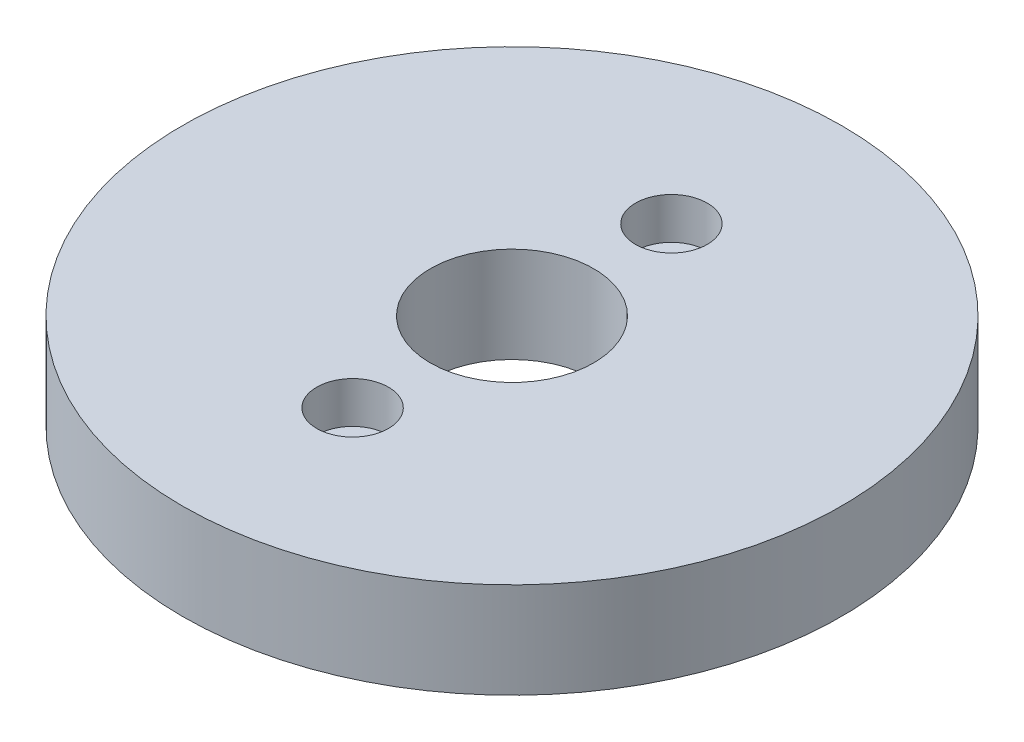
ISO-10303-21;
HEADER;
FILE_DESCRIPTION(('STEP AP214'),'2;1');
FILE_NAME('part.step','',(''),(''),'','','');
FILE_SCHEMA(('AUTOMOTIVE_DESIGN { 1 0 10303 214 1 1 1 1 }'));
ENDSEC;
DATA;
#1=APPLICATION_CONTEXT('core data for automotive mechanical design processes');
#2=APPLICATION_PROTOCOL_DEFINITION('international standard','automotive_design',2000,#1);
#3=PRODUCT_CONTEXT('',#1,'mechanical');
#4=PRODUCT('Part','Part','',(#3));
#5=PRODUCT_RELATED_PRODUCT_CATEGORY('part','',(#4));
#6=PRODUCT_DEFINITION_FORMATION('','',#4);
#7=PRODUCT_DEFINITION_CONTEXT('part definition',#1,'design');
#8=PRODUCT_DEFINITION('design','',#6,#7);
#9=PRODUCT_DEFINITION_SHAPE('','',#8);
#10=(LENGTH_UNIT() NAMED_UNIT(*) SI_UNIT(.MILLI.,.METRE.));
#11=(NAMED_UNIT(*) PLANE_ANGLE_UNIT() SI_UNIT($,.RADIAN.));
#12=(NAMED_UNIT(*) SI_UNIT($,.STERADIAN.) SOLID_ANGLE_UNIT());
#13=UNCERTAINTY_MEASURE_WITH_UNIT(LENGTH_MEASURE(1.E-05),#10,'distance_accuracy_value','');
#14=(GEOMETRIC_REPRESENTATION_CONTEXT(3) GLOBAL_UNCERTAINTY_ASSIGNED_CONTEXT((#13)) GLOBAL_UNIT_ASSIGNED_CONTEXT((#10,
#11,#12)) REPRESENTATION_CONTEXT('',''));
#15=CARTESIAN_POINT('',(0.,0.,0.));
#16=DIRECTION('',(0.,0.,1.));
#17=DIRECTION('',(1.,0.,0.));
#18=AXIS2_PLACEMENT_3D('',#15,#16,#17);
#19=CARTESIAN_POINT('',(0.,-13.,20.));
#20=DIRECTION('',(0.,1.,0.));
#21=DIRECTION('',(0.,0.,1.));
#22=AXIS2_PLACEMENT_3D('',#19,#20,#21);
#23=CYLINDRICAL_SURFACE('',#22,2.75);
#24=CARTESIAN_POINT('',(0.,0.,20.));
#25=DIRECTION('',(0.,1.,0.));
#26=DIRECTION('',(0.,0.,1.));
#27=AXIS2_PLACEMENT_3D('',#24,#25,#26);
#28=CIRCLE('',#27,2.75);
#29=CARTESIAN_POINT('',(0.,0.,22.75));
#30=VERTEX_POINT('',#29);
#31=EDGE_CURVE('E64',#30,#30,#28,.T.);
#32=ORIENTED_EDGE('',*,*,#31,.F.);
#33=EDGE_LOOP('',(#32));
#34=FACE_BOUND('',#33,.T.);
#35=CARTESIAN_POINT('',(0.,6.8,20.));
#36=DIRECTION('',(0.,1.,0.));
#37=DIRECTION('',(0.,0.,1.));
#38=AXIS2_PLACEMENT_3D('',#35,#36,#37);
#39=CIRCLE('',#38,2.75);
#40=CARTESIAN_POINT('',(0.,6.8,22.75));
#41=VERTEX_POINT('',#40);
#42=EDGE_CURVE('E47',#41,#41,#39,.F.);
#43=ORIENTED_EDGE('',*,*,#42,.F.);
#44=EDGE_LOOP('',(#43));
#45=FACE_BOUND('',#44,.T.);
#46=ADVANCED_FACE('F43',(#34,#45),#23,.F.);
#47=CARTESIAN_POINT('',(0.,-13.,-20.));
#48=DIRECTION('',(0.,1.,0.));
#49=DIRECTION('',(0.,0.,1.));
#50=AXIS2_PLACEMENT_3D('',#47,#48,#49);
#51=CYLINDRICAL_SURFACE('',#50,2.75);
#52=CARTESIAN_POINT('',(0.,0.,-20.));
#53=DIRECTION('',(0.,1.,0.));
#54=DIRECTION('',(0.,0.,1.));
#55=AXIS2_PLACEMENT_3D('',#52,#53,#54);
#56=CIRCLE('',#55,2.75);
#57=CARTESIAN_POINT('',(0.,0.,-17.25));
#58=VERTEX_POINT('',#57);
#59=EDGE_CURVE('E58',#58,#58,#56,.T.);
#60=ORIENTED_EDGE('',*,*,#59,.F.);
#61=EDGE_LOOP('',(#60));
#62=FACE_BOUND('',#61,.T.);
#63=CARTESIAN_POINT('',(0.,6.8,-20.));
#64=DIRECTION('',(0.,1.,0.));
#65=DIRECTION('',(0.,0.,1.));
#66=AXIS2_PLACEMENT_3D('',#63,#64,#65);
#67=CIRCLE('',#66,2.75);
#68=CARTESIAN_POINT('',(0.,6.8,-17.25));
#69=VERTEX_POINT('',#68);
#70=EDGE_CURVE('E74',#69,#69,#67,.F.);
#71=ORIENTED_EDGE('',*,*,#70,.F.);
#72=EDGE_LOOP('',(#71));
#73=FACE_BOUND('',#72,.T.);
#74=ADVANCED_FACE('F135',(#62,#73),#51,.F.);
#75=CARTESIAN_POINT('',(0.,12.,0.));
#76=DIRECTION('',(0.,-1.,0.));
#77=DIRECTION('',(0.,0.,-1.));
#78=AXIS2_PLACEMENT_3D('',#75,#76,#77);
#79=CYLINDRICAL_SURFACE('',#78,41.35);
#80=CARTESIAN_POINT('',(0.,12.,0.));
#81=DIRECTION('',(0.,1.,0.));
#82=DIRECTION('',(0.,0.,1.));
#83=AXIS2_PLACEMENT_3D('',#80,#81,#82);
#84=CIRCLE('',#83,41.35);
#85=CARTESIAN_POINT('',(0.,12.,41.35));
#86=VERTEX_POINT('',#85);
#87=EDGE_CURVE('E10',#86,#86,#84,.T.);
#88=ORIENTED_EDGE('',*,*,#87,.F.);
#89=EDGE_LOOP('',(#88));
#90=FACE_BOUND('',#89,.T.);
#91=CARTESIAN_POINT('',(0.,0.,0.));
#92=DIRECTION('',(0.,1.,0.));
#93=DIRECTION('',(0.,0.,1.));
#94=AXIS2_PLACEMENT_3D('',#91,#92,#93);
#95=CIRCLE('',#94,41.35);
#96=CARTESIAN_POINT('',(0.,0.,41.35));
#97=VERTEX_POINT('',#96);
#98=EDGE_CURVE('E52',#97,#97,#95,.T.);
#99=ORIENTED_EDGE('',*,*,#98,.T.);
#100=EDGE_LOOP('',(#99));
#101=FACE_BOUND('',#100,.T.);
#102=ADVANCED_FACE('F45',(#90,#101),#79,.T.);
#103=CARTESIAN_POINT('',(0.,12.,0.));
#104=DIRECTION('',(0.,1.,0.));
#105=DIRECTION('',(0.,0.,1.));
#106=AXIS2_PLACEMENT_3D('',#103,#104,#105);
#107=PLANE('',#106);
#108=CARTESIAN_POINT('',(0.,12.,-20.));
#109=DIRECTION('',(0.,1.,0.));
#110=DIRECTION('',(0.,0.,1.));
#111=AXIS2_PLACEMENT_3D('',#108,#109,#110);
#112=CIRCLE('',#111,4.5);
#113=CARTESIAN_POINT('',(0.,12.,-15.5));
#114=VERTEX_POINT('',#113);
#115=EDGE_CURVE('E84',#114,#114,#112,.T.);
#116=ORIENTED_EDGE('',*,*,#115,.F.);
#117=EDGE_LOOP('',(#116));
#118=FACE_BOUND('',#117,.T.);
#119=CARTESIAN_POINT('',(0.,12.,20.));
#120=DIRECTION('',(0.,1.,0.));
#121=DIRECTION('',(0.,0.,1.));
#122=AXIS2_PLACEMENT_3D('',#119,#120,#121);
#123=CIRCLE('',#122,4.5);
#124=CARTESIAN_POINT('',(0.,12.,24.5));
#125=VERTEX_POINT('',#124);
#126=EDGE_CURVE('E90',#125,#125,#123,.T.);
#127=ORIENTED_EDGE('',*,*,#126,.F.);
#128=EDGE_LOOP('',(#127));
#129=FACE_BOUND('',#128,.T.);
#130=CARTESIAN_POINT('',(0.,12.,0.));
#131=DIRECTION('',(0.,1.,0.));
#132=DIRECTION('',(0.,0.,1.));
#133=AXIS2_PLACEMENT_3D('',#130,#131,#132);
#134=CIRCLE('',#133,10.25);
#135=CARTESIAN_POINT('',(0.,12.,10.25));
#136=VERTEX_POINT('',#135);
#137=EDGE_CURVE('E61',#136,#136,#134,.T.);
#138=ORIENTED_EDGE('',*,*,#137,.F.);
#139=EDGE_LOOP('',(#138));
#140=FACE_BOUND('',#139,.T.);
#141=ORIENTED_EDGE('',*,*,#87,.T.);
#142=EDGE_LOOP('',(#141));
#143=FACE_BOUND('',#142,.T.);
#144=ADVANCED_FACE('F109',(#118,#129,#140,#143),#107,.T.);
#145=CARTESIAN_POINT('',(0.,0.,0.));
#146=DIRECTION('',(0.,1.,0.));
#147=DIRECTION('',(0.,0.,1.));
#148=AXIS2_PLACEMENT_3D('',#145,#146,#147);
#149=PLANE('',#148);
#150=CARTESIAN_POINT('',(0.,0.,0.));
#151=DIRECTION('',(0.,1.,0.));
#152=DIRECTION('',(0.,0.,1.));
#153=AXIS2_PLACEMENT_3D('',#150,#151,#152);
#154=CIRCLE('',#153,10.25);
#155=CARTESIAN_POINT('',(0.,0.,10.25));
#156=VERTEX_POINT('',#155);
#157=EDGE_CURVE('E68',#156,#156,#154,.T.);
#158=ORIENTED_EDGE('',*,*,#157,.T.);
#159=EDGE_LOOP('',(#158));
#160=FACE_BOUND('',#159,.T.);
#161=ORIENTED_EDGE('',*,*,#59,.T.);
#162=EDGE_LOOP('',(#161));
#163=FACE_BOUND('',#162,.T.);
#164=ORIENTED_EDGE('',*,*,#31,.T.);
#165=EDGE_LOOP('',(#164));
#166=FACE_BOUND('',#165,.T.);
#167=ORIENTED_EDGE('',*,*,#98,.F.);
#168=EDGE_LOOP('',(#167));
#169=FACE_BOUND('',#168,.T.);
#170=ADVANCED_FACE('F112',(#160,#163,#166,#169),#149,.F.);
#171=CARTESIAN_POINT('',(0.,-13.,0.));
#172=DIRECTION('',(0.,1.,0.));
#173=DIRECTION('',(0.,0.,1.));
#174=AXIS2_PLACEMENT_3D('',#171,#172,#173);
#175=CYLINDRICAL_SURFACE('',#174,10.25);
#176=ORIENTED_EDGE('',*,*,#137,.T.);
#177=EDGE_LOOP('',(#176));
#178=FACE_BOUND('',#177,.T.);
#179=ORIENTED_EDGE('',*,*,#157,.F.);
#180=EDGE_LOOP('',(#179));
#181=FACE_BOUND('',#180,.T.);
#182=ADVANCED_FACE('F119',(#178,#181),#175,.F.);
#183=CARTESIAN_POINT('',(0.,6.8,-20.));
#184=DIRECTION('',(0.,1.,0.));
#185=DIRECTION('',(0.,0.,1.));
#186=AXIS2_PLACEMENT_3D('',#183,#184,#185);
#187=PLANE('',#186);
#188=CARTESIAN_POINT('',(0.,6.8,-20.));
#189=DIRECTION('',(0.,1.,0.));
#190=DIRECTION('',(0.,0.,1.));
#191=AXIS2_PLACEMENT_3D('',#188,#189,#190);
#192=CIRCLE('',#191,4.5);
#193=CARTESIAN_POINT('',(0.,6.8,-15.5));
#194=VERTEX_POINT('',#193);
#195=EDGE_CURVE('E77',#194,#194,#192,.T.);
#196=ORIENTED_EDGE('',*,*,#195,.T.);
#197=EDGE_LOOP('',(#196));
#198=FACE_BOUND('',#197,.T.);
#199=ORIENTED_EDGE('',*,*,#70,.T.);
#200=EDGE_LOOP('',(#199));
#201=FACE_BOUND('',#200,.T.);
#202=ADVANCED_FACE('F122',(#198,#201),#187,.T.);
#203=CARTESIAN_POINT('',(0.,6.8,-20.));
#204=DIRECTION('',(0.,1.,0.));
#205=DIRECTION('',(0.,0.,1.));
#206=AXIS2_PLACEMENT_3D('',#203,#204,#205);
#207=CYLINDRICAL_SURFACE('',#206,4.5);
#208=ORIENTED_EDGE('',*,*,#195,.F.);
#209=EDGE_LOOP('',(#208));
#210=FACE_BOUND('',#209,.T.);
#211=ORIENTED_EDGE('',*,*,#115,.T.);
#212=EDGE_LOOP('',(#211));
#213=FACE_BOUND('',#212,.T.);
#214=ADVANCED_FACE('F150',(#210,#213),#207,.F.);
#215=CARTESIAN_POINT('',(0.,6.8,20.));
#216=DIRECTION('',(0.,1.,0.));
#217=DIRECTION('',(0.,0.,1.));
#218=AXIS2_PLACEMENT_3D('',#215,#216,#217);
#219=PLANE('',#218);
#220=CARTESIAN_POINT('',(0.,6.8,20.));
#221=DIRECTION('',(0.,1.,0.));
#222=DIRECTION('',(0.,0.,1.));
#223=AXIS2_PLACEMENT_3D('',#220,#221,#222);
#224=CIRCLE('',#223,4.5);
#225=CARTESIAN_POINT('',(0.,6.8,24.5));
#226=VERTEX_POINT('',#225);
#227=EDGE_CURVE('E95',#226,#226,#224,.T.);
#228=ORIENTED_EDGE('',*,*,#227,.T.);
#229=EDGE_LOOP('',(#228));
#230=FACE_BOUND('',#229,.T.);
#231=ORIENTED_EDGE('',*,*,#42,.T.);
#232=EDGE_LOOP('',(#231));
#233=FACE_BOUND('',#232,.T.);
#234=ADVANCED_FACE('F100',(#230,#233),#219,.T.);
#235=CARTESIAN_POINT('',(0.,6.8,20.));
#236=DIRECTION('',(0.,1.,0.));
#237=DIRECTION('',(0.,0.,1.));
#238=AXIS2_PLACEMENT_3D('',#235,#236,#237);
#239=CYLINDRICAL_SURFACE('',#238,4.5);
#240=ORIENTED_EDGE('',*,*,#227,.F.);
#241=EDGE_LOOP('',(#240));
#242=FACE_BOUND('',#241,.T.);
#243=ORIENTED_EDGE('',*,*,#126,.T.);
#244=EDGE_LOOP('',(#243));
#245=FACE_BOUND('',#244,.T.);
#246=ADVANCED_FACE('F103',(#242,#245),#239,.F.);
#247=CLOSED_SHELL('',(#46,#74,#102,#144,#170,#182,#202,#214,#234,#246));
#248=MANIFOLD_SOLID_BREP('B2',#247);
#249=ADVANCED_BREP_SHAPE_REPRESENTATION('',(#18,#248),#14);
#250=SHAPE_DEFINITION_REPRESENTATION(#9,#249);
ENDSEC;
END-ISO-10303-21;
